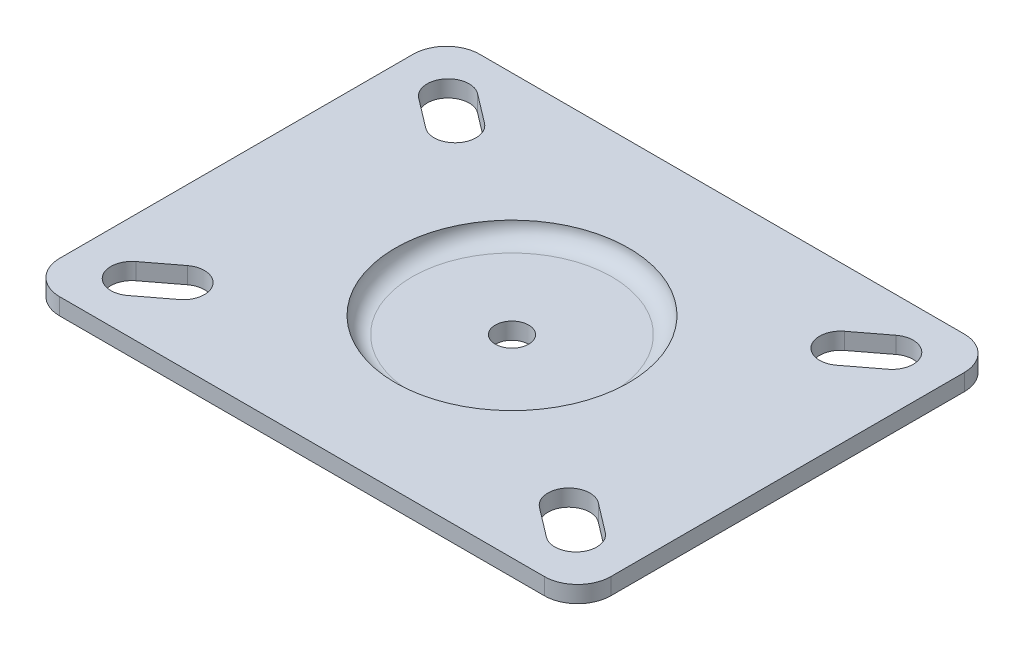
ISO-10303-21;
HEADER;
FILE_DESCRIPTION(('STEP AP214'),'2;1');
FILE_NAME('part.step','',(''),(''),'','','');
FILE_SCHEMA(('AUTOMOTIVE_DESIGN { 1 0 10303 214 1 1 1 1 }'));
ENDSEC;
DATA;
#1=APPLICATION_CONTEXT('core data for automotive mechanical design processes');
#2=APPLICATION_PROTOCOL_DEFINITION('international standard','automotive_design',2000,#1);
#3=PRODUCT_CONTEXT('',#1,'mechanical');
#4=PRODUCT('Part','Part','',(#3));
#5=PRODUCT_RELATED_PRODUCT_CATEGORY('part','',(#4));
#6=PRODUCT_DEFINITION_FORMATION('','',#4);
#7=PRODUCT_DEFINITION_CONTEXT('part definition',#1,'design');
#8=PRODUCT_DEFINITION('design','',#6,#7);
#9=PRODUCT_DEFINITION_SHAPE('','',#8);
#10=(LENGTH_UNIT() NAMED_UNIT(*) SI_UNIT(.MILLI.,.METRE.));
#11=(NAMED_UNIT(*) PLANE_ANGLE_UNIT() SI_UNIT($,.RADIAN.));
#12=(NAMED_UNIT(*) SI_UNIT($,.STERADIAN.) SOLID_ANGLE_UNIT());
#13=UNCERTAINTY_MEASURE_WITH_UNIT(LENGTH_MEASURE(1.E-05),#10,'distance_accuracy_value','');
#14=(GEOMETRIC_REPRESENTATION_CONTEXT(3) GLOBAL_UNCERTAINTY_ASSIGNED_CONTEXT((#13)) GLOBAL_UNIT_ASSIGNED_CONTEXT((#10,
#11,#12)) REPRESENTATION_CONTEXT('',''));
#15=CARTESIAN_POINT('',(0.,0.,0.));
#16=DIRECTION('',(0.,0.,1.));
#17=DIRECTION('',(1.,0.,0.));
#18=AXIS2_PLACEMENT_3D('',#15,#16,#17);
#19=CARTESIAN_POINT('',(52.5,3.175,40.));
#20=DIRECTION('',(-1.,0.,0.));
#21=DIRECTION('',(0.,0.,1.));
#22=AXIS2_PLACEMENT_3D('',#19,#20,#21);
#23=PLANE('',#22);
#24=DIRECTION('',(0.,0.,-1.));
#25=VECTOR('',#24,1.);
#26=CARTESIAN_POINT('',(52.5,3.175,40.));
#27=LINE('',#26,#25);
#28=CARTESIAN_POINT('',(52.5,3.175,33.65));
#29=VERTEX_POINT('',#28);
#30=CARTESIAN_POINT('',(52.5,3.175,-33.65));
#31=VERTEX_POINT('',#30);
#32=EDGE_CURVE('E422',#29,#31,#27,.T.);
#33=ORIENTED_EDGE('',*,*,#32,.F.);
#34=DIRECTION('',(0.,-1.,0.));
#35=VECTOR('',#34,1.);
#36=CARTESIAN_POINT('',(52.5,3.175,33.65));
#37=LINE('',#36,#35);
#38=CARTESIAN_POINT('',(52.5,0.,33.65));
#39=VERTEX_POINT('',#38);
#40=EDGE_CURVE('E493',#29,#39,#37,.T.);
#41=ORIENTED_EDGE('',*,*,#40,.T.);
#42=DIRECTION('',(0.,0.,-1.));
#43=VECTOR('',#42,1.);
#44=CARTESIAN_POINT('',(52.5,0.,40.));
#45=LINE('',#44,#43);
#46=CARTESIAN_POINT('',(52.5,0.,-33.65));
#47=VERTEX_POINT('',#46);
#48=EDGE_CURVE('E437',#39,#47,#45,.T.);
#49=ORIENTED_EDGE('',*,*,#48,.T.);
#50=DIRECTION('',(0.,-1.,0.));
#51=VECTOR('',#50,1.);
#52=CARTESIAN_POINT('',(52.5,3.175,-33.65));
#53=LINE('',#52,#51);
#54=EDGE_CURVE('E490',#47,#31,#53,.F.);
#55=ORIENTED_EDGE('',*,*,#54,.T.);
#56=EDGE_LOOP('',(#33,#41,#49,#55));
#57=FACE_BOUND('',#56,.T.);
#58=ADVANCED_FACE('F38',(#57),#23,.F.);
#59=CARTESIAN_POINT('',(52.5,3.175,-40.));
#60=DIRECTION('',(0.,0.,1.));
#61=DIRECTION('',(1.,0.,0.));
#62=AXIS2_PLACEMENT_3D('',#59,#60,#61);
#63=PLANE('',#62);
#64=DIRECTION('',(-1.,0.,0.));
#65=VECTOR('',#64,1.);
#66=CARTESIAN_POINT('',(52.5,0.,-40.));
#67=LINE('',#66,#65);
#68=CARTESIAN_POINT('',(46.15,0.,-40.));
#69=VERTEX_POINT('',#68);
#70=CARTESIAN_POINT('',(-46.15,0.,-40.));
#71=VERTEX_POINT('',#70);
#72=EDGE_CURVE('E441',#69,#71,#67,.T.);
#73=ORIENTED_EDGE('',*,*,#72,.T.);
#74=DIRECTION('',(0.,-1.,0.));
#75=VECTOR('',#74,1.);
#76=CARTESIAN_POINT('',(-46.15,3.175,-40.));
#77=LINE('',#76,#75);
#78=CARTESIAN_POINT('',(-46.15,3.175,-40.));
#79=VERTEX_POINT('',#78);
#80=EDGE_CURVE('E57',#71,#79,#77,.F.);
#81=ORIENTED_EDGE('',*,*,#80,.T.);
#82=DIRECTION('',(-1.,0.,0.));
#83=VECTOR('',#82,1.);
#84=CARTESIAN_POINT('',(52.5,3.175,-40.));
#85=LINE('',#84,#83);
#86=CARTESIAN_POINT('',(46.15,3.175,-40.));
#87=VERTEX_POINT('',#86);
#88=EDGE_CURVE('E425',#87,#79,#85,.T.);
#89=ORIENTED_EDGE('',*,*,#88,.F.);
#90=DIRECTION('',(0.,-1.,0.));
#91=VECTOR('',#90,1.);
#92=CARTESIAN_POINT('',(46.15,3.175,-40.));
#93=LINE('',#92,#91);
#94=EDGE_CURVE('E484',#87,#69,#93,.T.);
#95=ORIENTED_EDGE('',*,*,#94,.T.);
#96=EDGE_LOOP('',(#73,#81,#89,#95));
#97=FACE_BOUND('',#96,.T.);
#98=ADVANCED_FACE('F516',(#97),#63,.F.);
#99=CARTESIAN_POINT('',(-52.5,3.175,40.));
#100=DIRECTION('',(1.,0.,0.));
#101=DIRECTION('',(0.,0.,-1.));
#102=AXIS2_PLACEMENT_3D('',#99,#100,#101);
#103=PLANE('',#102);
#104=DIRECTION('',(0.,0.,1.));
#105=VECTOR('',#104,1.);
#106=CARTESIAN_POINT('',(-52.5,0.,40.));
#107=LINE('',#106,#105);
#108=CARTESIAN_POINT('',(-52.5,0.,-33.65));
#109=VERTEX_POINT('',#108);
#110=CARTESIAN_POINT('',(-52.5,0.,33.65));
#111=VERTEX_POINT('',#110);
#112=EDGE_CURVE('E444',#109,#111,#107,.T.);
#113=ORIENTED_EDGE('',*,*,#112,.T.);
#114=DIRECTION('',(0.,-1.,0.));
#115=VECTOR('',#114,1.);
#116=CARTESIAN_POINT('',(-52.5,3.175,33.65));
#117=LINE('',#116,#115);
#118=CARTESIAN_POINT('',(-52.5,3.175,33.65));
#119=VERTEX_POINT('',#118);
#120=EDGE_CURVE('E472',#111,#119,#117,.F.);
#121=ORIENTED_EDGE('',*,*,#120,.T.);
#122=DIRECTION('',(0.,0.,1.));
#123=VECTOR('',#122,1.);
#124=CARTESIAN_POINT('',(-52.5,3.175,40.));
#125=LINE('',#124,#123);
#126=CARTESIAN_POINT('',(-52.5,3.175,-33.65));
#127=VERTEX_POINT('',#126);
#128=EDGE_CURVE('E429',#127,#119,#125,.T.);
#129=ORIENTED_EDGE('',*,*,#128,.F.);
#130=DIRECTION('',(0.,-1.,0.));
#131=VECTOR('',#130,1.);
#132=CARTESIAN_POINT('',(-52.5,3.175,-33.65));
#133=LINE('',#132,#131);
#134=EDGE_CURVE('E469',#127,#109,#133,.T.);
#135=ORIENTED_EDGE('',*,*,#134,.T.);
#136=EDGE_LOOP('',(#113,#121,#129,#135));
#137=FACE_BOUND('',#136,.T.);
#138=ADVANCED_FACE('F522',(#137),#103,.F.);
#139=CARTESIAN_POINT('',(52.5,3.175,40.));
#140=DIRECTION('',(0.,0.,-1.));
#141=DIRECTION('',(-1.,0.,0.));
#142=AXIS2_PLACEMENT_3D('',#139,#140,#141);
#143=PLANE('',#142);
#144=DIRECTION('',(1.,0.,0.));
#145=VECTOR('',#144,1.);
#146=CARTESIAN_POINT('',(52.5,3.175,40.));
#147=LINE('',#146,#145);
#148=CARTESIAN_POINT('',(-46.15,3.175,40.));
#149=VERTEX_POINT('',#148);
#150=CARTESIAN_POINT('',(46.15,3.175,40.));
#151=VERTEX_POINT('',#150);
#152=EDGE_CURVE('E432',#149,#151,#147,.T.);
#153=ORIENTED_EDGE('',*,*,#152,.F.);
#154=DIRECTION('',(0.,-1.,0.));
#155=VECTOR('',#154,1.);
#156=CARTESIAN_POINT('',(-46.15,3.175,40.));
#157=LINE('',#156,#155);
#158=CARTESIAN_POINT('',(-46.15,0.,40.));
#159=VERTEX_POINT('',#158);
#160=EDGE_CURVE('E455',#149,#159,#157,.T.);
#161=ORIENTED_EDGE('',*,*,#160,.T.);
#162=DIRECTION('',(1.,0.,0.));
#163=VECTOR('',#162,1.);
#164=CARTESIAN_POINT('',(52.5,0.,40.));
#165=LINE('',#164,#163);
#166=CARTESIAN_POINT('',(46.15,0.,40.));
#167=VERTEX_POINT('',#166);
#168=EDGE_CURVE('E426',#159,#167,#165,.T.);
#169=ORIENTED_EDGE('',*,*,#168,.T.);
#170=DIRECTION('',(0.,-1.,0.));
#171=VECTOR('',#170,1.);
#172=CARTESIAN_POINT('',(46.15,3.175,40.));
#173=LINE('',#172,#171);
#174=EDGE_CURVE('E436',#167,#151,#173,.F.);
#175=ORIENTED_EDGE('',*,*,#174,.T.);
#176=EDGE_LOOP('',(#153,#161,#169,#175));
#177=FACE_BOUND('',#176,.T.);
#178=ADVANCED_FACE('F559',(#177),#143,.F.);
#179=CARTESIAN_POINT('',(52.5,3.175,-40.));
#180=DIRECTION('',(0.,1.,0.));
#181=DIRECTION('',(0.,0.,1.));
#182=AXIS2_PLACEMENT_3D('',#179,#180,#181);
#183=PLANE('',#182);
#184=CARTESIAN_POINT('',(-42.2840110201137,3.175,-30.12115125342));
#185=DIRECTION('',(0.,1.,0.));
#186=DIRECTION('',(0.,0.,-1.));
#187=AXIS2_PLACEMENT_3D('',#184,#185,#186);
#188=CIRCLE('',#187,4.);
#189=CARTESIAN_POINT('',(-39.8598381590623,3.175,-33.3028781335501));
#190=VERTEX_POINT('',#189);
#191=CARTESIAN_POINT('',(-44.7081838811652,3.175,-26.9394243732901));
#192=VERTEX_POINT('',#191);
#193=EDGE_CURVE('E243',#190,#192,#188,.T.);
#194=ORIENTED_EDGE('',*,*,#193,.F.);
#195=DIRECTION('',(-0.795431720032498,0.,-0.606043215262857));
#196=VECTOR('',#195,1.);
#197=CARTESIAN_POINT('',(-39.8598381590623,3.175,-33.3028781335501));
#198=LINE('',#197,#196);
#199=CARTESIAN_POINT('',(-34.2918161188348,3.175,-29.06057562671));
#200=VERTEX_POINT('',#199);
#201=EDGE_CURVE('E249',#200,#190,#198,.T.);
#202=ORIENTED_EDGE('',*,*,#201,.F.);
#203=CARTESIAN_POINT('',(-36.7159889798862,3.175,-25.87884874658));
#204=DIRECTION('',(0.,1.,0.));
#205=DIRECTION('',(0.,0.,-1.));
#206=AXIS2_PLACEMENT_3D('',#203,#204,#205);
#207=CIRCLE('',#206,4.);
#208=CARTESIAN_POINT('',(-39.1401618409377,3.175,-22.6971218664501));
#209=VERTEX_POINT('',#208);
#210=EDGE_CURVE('E277',#209,#200,#207,.T.);
#211=ORIENTED_EDGE('',*,*,#210,.F.);
#212=DIRECTION('',(0.795431720032498,0.,0.606043215262857));
#213=VECTOR('',#212,1.);
#214=CARTESIAN_POINT('',(-44.7081838811652,3.175,-26.9394243732901));
#215=LINE('',#214,#213);
#216=EDGE_CURVE('E270',#192,#209,#215,.T.);
#217=ORIENTED_EDGE('',*,*,#216,.F.);
#218=EDGE_LOOP('',(#194,#202,#211,#217));
#219=FACE_BOUND('',#218,.T.);
#220=CARTESIAN_POINT('',(42.2840110201137,3.175,30.1211512534201));
#221=DIRECTION('',(0.,1.,0.));
#222=DIRECTION('',(0.,0.,-1.));
#223=AXIS2_PLACEMENT_3D('',#220,#221,#222);
#224=CIRCLE('',#223,4.);
#225=CARTESIAN_POINT('',(39.8598381590623,3.175,33.3028781335501));
#226=VERTEX_POINT('',#225);
#227=CARTESIAN_POINT('',(44.7081838811652,3.175,26.9394243732901));
#228=VERTEX_POINT('',#227);
#229=EDGE_CURVE('E301',#226,#228,#224,.T.);
#230=ORIENTED_EDGE('',*,*,#229,.F.);
#231=DIRECTION('',(0.795431720032498,0.,0.606043215262857));
#232=VECTOR('',#231,1.);
#233=CARTESIAN_POINT('',(39.8598381590623,3.175,33.3028781335501));
#234=LINE('',#233,#232);
#235=CARTESIAN_POINT('',(34.2918161188348,3.175,29.06057562671));
#236=VERTEX_POINT('',#235);
#237=EDGE_CURVE('E312',#236,#226,#234,.T.);
#238=ORIENTED_EDGE('',*,*,#237,.F.);
#239=CARTESIAN_POINT('',(36.7159889798863,3.175,25.8788487465801));
#240=DIRECTION('',(0.,1.,0.));
#241=DIRECTION('',(0.,0.,-1.));
#242=AXIS2_PLACEMENT_3D('',#239,#240,#241);
#243=CIRCLE('',#242,4.00000000000001);
#244=CARTESIAN_POINT('',(39.1401618409377,3.175,22.69712186645));
#245=VERTEX_POINT('',#244);
#246=EDGE_CURVE('E308',#245,#236,#243,.T.);
#247=ORIENTED_EDGE('',*,*,#246,.F.);
#248=DIRECTION('',(-0.795431720032498,0.,-0.606043215262857));
#249=VECTOR('',#248,1.);
#250=CARTESIAN_POINT('',(44.7081838811652,3.175,26.9394243732901));
#251=LINE('',#250,#249);
#252=EDGE_CURVE('E304',#228,#245,#251,.T.);
#253=ORIENTED_EDGE('',*,*,#252,.F.);
#254=EDGE_LOOP('',(#230,#238,#247,#253));
#255=FACE_BOUND('',#254,.T.);
#256=CARTESIAN_POINT('',(-42.2840110201137,3.175,30.12115125342));
#257=DIRECTION('',(0.,1.,0.));
#258=DIRECTION('',(0.,0.,1.));
#259=AXIS2_PLACEMENT_3D('',#256,#257,#258);
#260=CIRCLE('',#259,4.);
#261=CARTESIAN_POINT('',(-44.7081838811652,3.175,26.9394243732901));
#262=VERTEX_POINT('',#261);
#263=CARTESIAN_POINT('',(-39.8598381590623,3.175,33.30287813355));
#264=VERTEX_POINT('',#263);
#265=EDGE_CURVE('E342',#262,#264,#260,.T.);
#266=ORIENTED_EDGE('',*,*,#265,.F.);
#267=DIRECTION('',(-0.795431720032498,0.,0.606043215262857));
#268=VECTOR('',#267,1.);
#269=CARTESIAN_POINT('',(-44.7081838811652,3.175,26.9394243732901));
#270=LINE('',#269,#268);
#271=CARTESIAN_POINT('',(-39.1401618409377,3.175,22.6971218664501));
#272=VERTEX_POINT('',#271);
#273=EDGE_CURVE('E351',#272,#262,#270,.T.);
#274=ORIENTED_EDGE('',*,*,#273,.F.);
#275=CARTESIAN_POINT('',(-36.7159889798862,3.175,25.87884874658));
#276=DIRECTION('',(0.,1.,0.));
#277=DIRECTION('',(0.,0.,1.));
#278=AXIS2_PLACEMENT_3D('',#275,#276,#277);
#279=CIRCLE('',#278,4.);
#280=CARTESIAN_POINT('',(-34.2918161188348,3.175,29.06057562671));
#281=VERTEX_POINT('',#280);
#282=EDGE_CURVE('E347',#281,#272,#279,.T.);
#283=ORIENTED_EDGE('',*,*,#282,.F.);
#284=DIRECTION('',(0.795431720032498,0.,-0.606043215262857));
#285=VECTOR('',#284,1.);
#286=CARTESIAN_POINT('',(-39.8598381590623,3.175,33.3028781335501));
#287=LINE('',#286,#285);
#288=EDGE_CURVE('E344',#264,#281,#287,.T.);
#289=ORIENTED_EDGE('',*,*,#288,.F.);
#290=EDGE_LOOP('',(#266,#274,#283,#289));
#291=FACE_BOUND('',#290,.T.);
#292=CARTESIAN_POINT('',(42.2840110201137,3.175,-30.1211512534201));
#293=DIRECTION('',(0.,1.,0.));
#294=DIRECTION('',(0.,0.,1.));
#295=AXIS2_PLACEMENT_3D('',#292,#293,#294);
#296=CIRCLE('',#295,4.);
#297=CARTESIAN_POINT('',(44.7081838811652,3.175,-26.9394243732901));
#298=VERTEX_POINT('',#297);
#299=CARTESIAN_POINT('',(39.8598381590623,3.175,-33.3028781335501));
#300=VERTEX_POINT('',#299);
#301=EDGE_CURVE('E385',#298,#300,#296,.T.);
#302=ORIENTED_EDGE('',*,*,#301,.F.);
#303=DIRECTION('',(0.795431720032498,0.,-0.606043215262857));
#304=VECTOR('',#303,1.);
#305=CARTESIAN_POINT('',(44.7081838811652,3.175,-26.9394243732901));
#306=LINE('',#305,#304);
#307=CARTESIAN_POINT('',(39.1401618409377,3.175,-22.69712186645));
#308=VERTEX_POINT('',#307);
#309=EDGE_CURVE('E396',#308,#298,#306,.T.);
#310=ORIENTED_EDGE('',*,*,#309,.F.);
#311=CARTESIAN_POINT('',(36.7159889798863,3.175,-25.8788487465801));
#312=DIRECTION('',(0.,1.,0.));
#313=DIRECTION('',(0.,0.,1.));
#314=AXIS2_PLACEMENT_3D('',#311,#312,#313);
#315=CIRCLE('',#314,4.00000000000001);
#316=CARTESIAN_POINT('',(34.2918161188348,3.175,-29.06057562671));
#317=VERTEX_POINT('',#316);
#318=EDGE_CURVE('E392',#317,#308,#315,.T.);
#319=ORIENTED_EDGE('',*,*,#318,.F.);
#320=DIRECTION('',(-0.795431720032498,0.,0.606043215262857));
#321=VECTOR('',#320,1.);
#322=CARTESIAN_POINT('',(39.8598381590623,3.175,-33.3028781335501));
#323=LINE('',#322,#321);
#324=EDGE_CURVE('E388',#300,#317,#323,.T.);
#325=ORIENTED_EDGE('',*,*,#324,.F.);
#326=EDGE_LOOP('',(#302,#310,#319,#325));
#327=FACE_BOUND('',#326,.T.);
#328=CARTESIAN_POINT('',(0.,3.175,0.));
#329=DIRECTION('',(0.,1.,0.));
#330=DIRECTION('',(0.,0.,1.));
#331=AXIS2_PLACEMENT_3D('',#328,#329,#330);
#332=CIRCLE('',#331,22.225);
#333=CARTESIAN_POINT('',(0.,3.175,22.225));
#334=VERTEX_POINT('',#333);
#335=EDGE_CURVE('E417',#334,#334,#332,.T.);
#336=ORIENTED_EDGE('',*,*,#335,.F.);
#337=EDGE_LOOP('',(#336));
#338=FACE_BOUND('',#337,.T.);
#339=ORIENTED_EDGE('',*,*,#128,.T.);
#340=CARTESIAN_POINT('',(-46.15,3.175,33.65));
#341=DIRECTION('',(0.,1.,0.));
#342=DIRECTION('',(0.,0.,1.));
#343=AXIS2_PLACEMENT_3D('',#340,#341,#342);
#344=CIRCLE('',#343,6.35);
#345=EDGE_CURVE('E482',#119,#149,#344,.T.);
#346=ORIENTED_EDGE('',*,*,#345,.T.);
#347=ORIENTED_EDGE('',*,*,#152,.T.);
#348=CARTESIAN_POINT('',(46.15,3.175,33.65));
#349=DIRECTION('',(0.,1.,0.));
#350=DIRECTION('',(0.,0.,1.));
#351=AXIS2_PLACEMENT_3D('',#348,#349,#350);
#352=CIRCLE('',#351,6.35);
#353=EDGE_CURVE('E476',#151,#29,#352,.T.);
#354=ORIENTED_EDGE('',*,*,#353,.T.);
#355=ORIENTED_EDGE('',*,*,#32,.T.);
#356=CARTESIAN_POINT('',(46.15,3.175,-33.65));
#357=DIRECTION('',(0.,1.,0.));
#358=DIRECTION('',(0.,0.,1.));
#359=AXIS2_PLACEMENT_3D('',#356,#357,#358);
#360=CIRCLE('',#359,6.35);
#361=EDGE_CURVE('E67',#31,#87,#360,.T.);
#362=ORIENTED_EDGE('',*,*,#361,.T.);
#363=ORIENTED_EDGE('',*,*,#88,.T.);
#364=CARTESIAN_POINT('',(-46.15,3.175,-33.65));
#365=DIRECTION('',(0.,1.,0.));
#366=DIRECTION('',(0.,0.,1.));
#367=AXIS2_PLACEMENT_3D('',#364,#365,#366);
#368=CIRCLE('',#367,6.35);
#369=EDGE_CURVE('E479',#79,#127,#368,.T.);
#370=ORIENTED_EDGE('',*,*,#369,.T.);
#371=EDGE_LOOP('',(#339,#346,#347,#354,#355,#362,#363,#370));
#372=FACE_BOUND('',#371,.T.);
#373=ADVANCED_FACE('F542',(#219,#255,#291,#327,#338,#372),#183,.T.);
#374=CARTESIAN_POINT('',(52.5,0.,-40.));
#375=DIRECTION('',(0.,1.,0.));
#376=DIRECTION('',(0.,0.,1.));
#377=AXIS2_PLACEMENT_3D('',#374,#375,#376);
#378=PLANE('',#377);
#379=DIRECTION('',(0.795431720032499,0.,0.606043215262857));
#380=VECTOR('',#379,1.);
#381=CARTESIAN_POINT('',(-39.8598381590623,0.,-33.3028781335501));
#382=LINE('',#381,#380);
#383=CARTESIAN_POINT('',(-39.8598381590623,0.,-33.3028781335501));
#384=VERTEX_POINT('',#383);
#385=CARTESIAN_POINT('',(-34.2918161188348,0.,-29.06057562671));
#386=VERTEX_POINT('',#385);
#387=EDGE_CURVE('E264',#384,#386,#382,.T.);
#388=ORIENTED_EDGE('',*,*,#387,.F.);
#389=CARTESIAN_POINT('',(-42.2840110201137,0.,-30.12115125342));
#390=DIRECTION('',(0.,1.,0.));
#391=DIRECTION('',(0.,0.,1.));
#392=AXIS2_PLACEMENT_3D('',#389,#390,#391);
#393=CIRCLE('',#392,4.);
#394=CARTESIAN_POINT('',(-44.7081838811652,0.,-26.9394243732901));
#395=VERTEX_POINT('',#394);
#396=EDGE_CURVE('E240',#395,#384,#393,.F.);
#397=ORIENTED_EDGE('',*,*,#396,.F.);
#398=DIRECTION('',(-0.795431720032498,0.,-0.606043215262857));
#399=VECTOR('',#398,1.);
#400=CARTESIAN_POINT('',(-44.7081838811652,0.,-26.9394243732901));
#401=LINE('',#400,#399);
#402=CARTESIAN_POINT('',(-39.1401618409377,0.,-22.6971218664501));
#403=VERTEX_POINT('',#402);
#404=EDGE_CURVE('E253',#403,#395,#401,.T.);
#405=ORIENTED_EDGE('',*,*,#404,.F.);
#406=CARTESIAN_POINT('',(-36.7159889798862,0.,-25.87884874658));
#407=DIRECTION('',(0.,1.,0.));
#408=DIRECTION('',(0.,0.,1.));
#409=AXIS2_PLACEMENT_3D('',#406,#407,#408);
#410=CIRCLE('',#409,4.);
#411=EDGE_CURVE('E272',#386,#403,#410,.F.);
#412=ORIENTED_EDGE('',*,*,#411,.F.);
#413=EDGE_LOOP('',(#388,#397,#405,#412));
#414=FACE_BOUND('',#413,.T.);
#415=DIRECTION('',(-0.795431720032499,0.,-0.606043215262857));
#416=VECTOR('',#415,1.);
#417=CARTESIAN_POINT('',(39.8598381590623,0.,33.3028781335501));
#418=LINE('',#417,#416);
#419=CARTESIAN_POINT('',(39.8598381590623,0.,33.3028781335501));
#420=VERTEX_POINT('',#419);
#421=CARTESIAN_POINT('',(34.2918161188348,0.,29.06057562671));
#422=VERTEX_POINT('',#421);
#423=EDGE_CURVE('E293',#420,#422,#418,.T.);
#424=ORIENTED_EDGE('',*,*,#423,.F.);
#425=CARTESIAN_POINT('',(42.2840110201137,0.,30.1211512534201));
#426=DIRECTION('',(0.,1.,0.));
#427=DIRECTION('',(0.,0.,1.));
#428=AXIS2_PLACEMENT_3D('',#425,#426,#427);
#429=CIRCLE('',#428,4.);
#430=CARTESIAN_POINT('',(44.7081838811652,0.,26.9394243732901));
#431=VERTEX_POINT('',#430);
#432=EDGE_CURVE('E297',#431,#420,#429,.F.);
#433=ORIENTED_EDGE('',*,*,#432,.F.);
#434=DIRECTION('',(0.795431720032498,0.,0.606043215262857));
#435=VECTOR('',#434,1.);
#436=CARTESIAN_POINT('',(44.7081838811652,0.,26.9394243732901));
#437=LINE('',#436,#435);
#438=CARTESIAN_POINT('',(39.1401618409377,0.,22.69712186645));
#439=VERTEX_POINT('',#438);
#440=EDGE_CURVE('E320',#439,#431,#437,.T.);
#441=ORIENTED_EDGE('',*,*,#440,.F.);
#442=CARTESIAN_POINT('',(36.7159889798863,0.,25.8788487465801));
#443=DIRECTION('',(0.,1.,0.));
#444=DIRECTION('',(0.,0.,1.));
#445=AXIS2_PLACEMENT_3D('',#442,#443,#444);
#446=CIRCLE('',#445,4.00000000000001);
#447=EDGE_CURVE('E258',#422,#439,#446,.F.);
#448=ORIENTED_EDGE('',*,*,#447,.F.);
#449=EDGE_LOOP('',(#424,#433,#441,#448));
#450=FACE_BOUND('',#449,.T.);
#451=DIRECTION('',(0.795431720032498,0.,-0.606043215262857));
#452=VECTOR('',#451,1.);
#453=CARTESIAN_POINT('',(-44.7081838811652,0.,26.9394243732901));
#454=LINE('',#453,#452);
#455=CARTESIAN_POINT('',(-44.7081838811652,0.,26.9394243732901));
#456=VERTEX_POINT('',#455);
#457=CARTESIAN_POINT('',(-39.1401618409377,0.,22.6971218664501));
#458=VERTEX_POINT('',#457);
#459=EDGE_CURVE('E336',#456,#458,#454,.T.);
#460=ORIENTED_EDGE('',*,*,#459,.F.);
#461=CARTESIAN_POINT('',(-42.2840110201137,0.,30.12115125342));
#462=DIRECTION('',(0.,1.,0.));
#463=DIRECTION('',(0.,0.,1.));
#464=AXIS2_PLACEMENT_3D('',#461,#462,#463);
#465=CIRCLE('',#464,4.);
#466=CARTESIAN_POINT('',(-39.8598381590623,0.,33.3028781335501));
#467=VERTEX_POINT('',#466);
#468=EDGE_CURVE('E339',#467,#456,#465,.F.);
#469=ORIENTED_EDGE('',*,*,#468,.F.);
#470=DIRECTION('',(-0.795431720032499,0.,0.606043215262857));
#471=VECTOR('',#470,1.);
#472=CARTESIAN_POINT('',(-39.8598381590623,0.,33.3028781335501));
#473=LINE('',#472,#471);
#474=CARTESIAN_POINT('',(-34.2918161188348,0.,29.0605756267101));
#475=VERTEX_POINT('',#474);
#476=EDGE_CURVE('E357',#475,#467,#473,.T.);
#477=ORIENTED_EDGE('',*,*,#476,.F.);
#478=CARTESIAN_POINT('',(-36.7159889798862,0.,25.87884874658));
#479=DIRECTION('',(0.,1.,0.));
#480=DIRECTION('',(0.,0.,1.));
#481=AXIS2_PLACEMENT_3D('',#478,#479,#480);
#482=CIRCLE('',#481,4.);
#483=EDGE_CURVE('E333',#458,#475,#482,.F.);
#484=ORIENTED_EDGE('',*,*,#483,.F.);
#485=EDGE_LOOP('',(#460,#469,#477,#484));
#486=FACE_BOUND('',#485,.T.);
#487=DIRECTION('',(-0.795431720032498,0.,0.606043215262857));
#488=VECTOR('',#487,1.);
#489=CARTESIAN_POINT('',(44.7081838811652,0.,-26.9394243732901));
#490=LINE('',#489,#488);
#491=CARTESIAN_POINT('',(44.7081838811652,0.,-26.9394243732901));
#492=VERTEX_POINT('',#491);
#493=CARTESIAN_POINT('',(39.1401618409377,0.,-22.69712186645));
#494=VERTEX_POINT('',#493);
#495=EDGE_CURVE('E377',#492,#494,#490,.T.);
#496=ORIENTED_EDGE('',*,*,#495,.F.);
#497=CARTESIAN_POINT('',(42.2840110201137,0.,-30.1211512534201));
#498=DIRECTION('',(0.,1.,0.));
#499=DIRECTION('',(0.,0.,1.));
#500=AXIS2_PLACEMENT_3D('',#497,#498,#499);
#501=CIRCLE('',#500,4.);
#502=CARTESIAN_POINT('',(39.8598381590623,0.,-33.3028781335501));
#503=VERTEX_POINT('',#502);
#504=EDGE_CURVE('E381',#503,#492,#501,.F.);
#505=ORIENTED_EDGE('',*,*,#504,.F.);
#506=DIRECTION('',(0.795431720032499,0.,-0.606043215262857));
#507=VECTOR('',#506,1.);
#508=CARTESIAN_POINT('',(39.8598381590623,0.,-33.3028781335501));
#509=LINE('',#508,#507);
#510=CARTESIAN_POINT('',(34.2918161188348,0.,-29.0605756267101));
#511=VERTEX_POINT('',#510);
#512=EDGE_CURVE('E404',#511,#503,#509,.T.);
#513=ORIENTED_EDGE('',*,*,#512,.F.);
#514=CARTESIAN_POINT('',(36.7159889798863,0.,-25.8788487465801));
#515=DIRECTION('',(0.,1.,0.));
#516=DIRECTION('',(0.,0.,1.));
#517=AXIS2_PLACEMENT_3D('',#514,#515,#516);
#518=CIRCLE('',#517,4.00000000000001);
#519=EDGE_CURVE('E374',#494,#511,#518,.F.);
#520=ORIENTED_EDGE('',*,*,#519,.F.);
#521=EDGE_LOOP('',(#496,#505,#513,#520));
#522=FACE_BOUND('',#521,.T.);
#523=CARTESIAN_POINT('',(0.,0.,0.));
#524=DIRECTION('',(0.,1.,0.));
#525=DIRECTION('',(0.,0.,1.));
#526=AXIS2_PLACEMENT_3D('',#523,#524,#525);
#527=CIRCLE('',#526,25.4);
#528=CARTESIAN_POINT('',(0.,0.,25.4));
#529=VERTEX_POINT('',#528);
#530=EDGE_CURVE('E421',#529,#529,#527,.T.);
#531=ORIENTED_EDGE('',*,*,#530,.T.);
#532=EDGE_LOOP('',(#531));
#533=FACE_BOUND('',#532,.T.);
#534=ORIENTED_EDGE('',*,*,#168,.F.);
#535=CARTESIAN_POINT('',(-46.15,0.,33.65));
#536=DIRECTION('',(0.,1.,0.));
#537=DIRECTION('',(0.,0.,1.));
#538=AXIS2_PLACEMENT_3D('',#535,#536,#537);
#539=CIRCLE('',#538,6.35);
#540=EDGE_CURVE('E467',#159,#111,#539,.F.);
#541=ORIENTED_EDGE('',*,*,#540,.T.);
#542=ORIENTED_EDGE('',*,*,#112,.F.);
#543=CARTESIAN_POINT('',(-46.15,0.,-33.65));
#544=DIRECTION('',(0.,1.,0.));
#545=DIRECTION('',(0.,0.,1.));
#546=AXIS2_PLACEMENT_3D('',#543,#544,#545);
#547=CIRCLE('',#546,6.35);
#548=EDGE_CURVE('E464',#109,#71,#547,.F.);
#549=ORIENTED_EDGE('',*,*,#548,.T.);
#550=ORIENTED_EDGE('',*,*,#72,.F.);
#551=CARTESIAN_POINT('',(46.15,0.,-33.65));
#552=DIRECTION('',(0.,1.,0.));
#553=DIRECTION('',(0.,0.,1.));
#554=AXIS2_PLACEMENT_3D('',#551,#552,#553);
#555=CIRCLE('',#554,6.35);
#556=EDGE_CURVE('E458',#69,#47,#555,.F.);
#557=ORIENTED_EDGE('',*,*,#556,.T.);
#558=ORIENTED_EDGE('',*,*,#48,.F.);
#559=CARTESIAN_POINT('',(46.15,0.,33.65));
#560=DIRECTION('',(0.,1.,0.));
#561=DIRECTION('',(0.,0.,1.));
#562=AXIS2_PLACEMENT_3D('',#559,#560,#561);
#563=CIRCLE('',#562,6.35);
#564=EDGE_CURVE('E461',#39,#167,#563,.F.);
#565=ORIENTED_EDGE('',*,*,#564,.T.);
#566=EDGE_LOOP('',(#534,#541,#542,#549,#550,#557,#558,#565));
#567=FACE_BOUND('',#566,.T.);
#568=ADVANCED_FACE('F261',(#414,#450,#486,#522,#533,#567),#378,.F.);
#569=CARTESIAN_POINT('',(0.,-3.175,0.));
#570=DIRECTION('',(0.,1.,0.));
#571=DIRECTION('',(0.,0.,1.));
#572=AXIS2_PLACEMENT_3D('',#569,#570,#571);
#573=PLANE('',#572);
#574=CARTESIAN_POINT('',(0.,-3.175,0.));
#575=DIRECTION('',(0.,1.,0.));
#576=DIRECTION('',(0.,0.,1.));
#577=AXIS2_PLACEMENT_3D('',#574,#575,#576);
#578=CIRCLE('',#577,22.225);
#579=CARTESIAN_POINT('',(0.,-3.175,22.225));
#580=VERTEX_POINT('',#579);
#581=EDGE_CURVE('E11',#580,#580,#578,.F.);
#582=ORIENTED_EDGE('',*,*,#581,.T.);
#583=EDGE_LOOP('',(#582));
#584=FACE_BOUND('',#583,.T.);
#585=CARTESIAN_POINT('',(0.,-3.175,0.));
#586=DIRECTION('',(0.,1.,0.));
#587=DIRECTION('',(0.,0.,1.));
#588=AXIS2_PLACEMENT_3D('',#585,#586,#587);
#589=CIRCLE('',#588,3.175);
#590=CARTESIAN_POINT('',(0.,-3.175,3.175));
#591=VERTEX_POINT('',#590);
#592=EDGE_CURVE('E370',#591,#591,#589,.F.);
#593=ORIENTED_EDGE('',*,*,#592,.F.);
#594=EDGE_LOOP('',(#593));
#595=FACE_BOUND('',#594,.T.);
#596=ADVANCED_FACE('F570',(#584,#595),#573,.F.);
#597=CARTESIAN_POINT('',(0.,0.,0.));
#598=DIRECTION('',(0.,1.,0.));
#599=DIRECTION('',(0.,0.,1.));
#600=AXIS2_PLACEMENT_3D('',#597,#598,#599);
#601=PLANE('',#600);
#602=CARTESIAN_POINT('',(0.,0.,0.));
#603=DIRECTION('',(0.,1.,0.));
#604=DIRECTION('',(0.,0.,1.));
#605=AXIS2_PLACEMENT_3D('',#602,#603,#604);
#606=CIRCLE('',#605,19.05);
#607=CARTESIAN_POINT('',(0.,0.,19.05));
#608=VERTEX_POINT('',#607);
#609=EDGE_CURVE('E47',#608,#608,#606,.T.);
#610=ORIENTED_EDGE('',*,*,#609,.T.);
#611=EDGE_LOOP('',(#610));
#612=FACE_BOUND('',#611,.T.);
#613=CARTESIAN_POINT('',(0.,0.,0.));
#614=DIRECTION('',(0.,1.,0.));
#615=DIRECTION('',(0.,0.,1.));
#616=AXIS2_PLACEMENT_3D('',#613,#614,#615);
#617=CIRCLE('',#616,3.175);
#618=CARTESIAN_POINT('',(0.,0.,3.175));
#619=VERTEX_POINT('',#618);
#620=EDGE_CURVE('E366',#619,#619,#617,.F.);
#621=ORIENTED_EDGE('',*,*,#620,.T.);
#622=EDGE_LOOP('',(#621));
#623=FACE_BOUND('',#622,.T.);
#624=ADVANCED_FACE('F500',(#612,#623),#601,.T.);
#625=CARTESIAN_POINT('',(42.2840110201137,-3.176,-30.1211512534201));
#626=DIRECTION('',(0.,1.,0.));
#627=DIRECTION('',(0.,0.,1.));
#628=AXIS2_PLACEMENT_3D('',#625,#626,#627);
#629=CYLINDRICAL_SURFACE('',#628,4.);
#630=ORIENTED_EDGE('',*,*,#504,.T.);
#631=DIRECTION('',(0.,1.,0.));
#632=VECTOR('',#631,1.);
#633=CARTESIAN_POINT('',(44.7081838811652,-3.176,-26.9394243732901));
#634=LINE('',#633,#632);
#635=EDGE_CURVE('E401',#492,#298,#634,.T.);
#636=ORIENTED_EDGE('',*,*,#635,.T.);
#637=ORIENTED_EDGE('',*,*,#301,.T.);
#638=DIRECTION('',(0.,1.,0.));
#639=VECTOR('',#638,1.);
#640=CARTESIAN_POINT('',(39.8598381590623,-3.176,-33.3028781335501));
#641=LINE('',#640,#639);
#642=EDGE_CURVE('E400',#503,#300,#641,.T.);
#643=ORIENTED_EDGE('',*,*,#642,.F.);
#644=EDGE_LOOP('',(#630,#636,#637,#643));
#645=FACE_BOUND('',#644,.T.);
#646=ADVANCED_FACE('F577',(#645),#629,.F.);
#647=CARTESIAN_POINT('',(44.7081838811652,-3.176,-26.9394243732901));
#648=DIRECTION('',(0.606043215262857,0.,0.795431720032498));
#649=DIRECTION('',(0.795431720032498,0.,-0.606043215262857));
#650=AXIS2_PLACEMENT_3D('',#647,#648,#649);
#651=PLANE('',#650);
#652=ORIENTED_EDGE('',*,*,#495,.T.);
#653=DIRECTION('',(0.,1.,0.));
#654=VECTOR('',#653,1.);
#655=CARTESIAN_POINT('',(39.1401618409377,-3.176,-22.69712186645));
#656=LINE('',#655,#654);
#657=EDGE_CURVE('E405',#494,#308,#656,.T.);
#658=ORIENTED_EDGE('',*,*,#657,.T.);
#659=ORIENTED_EDGE('',*,*,#309,.T.);
#660=ORIENTED_EDGE('',*,*,#635,.F.);
#661=EDGE_LOOP('',(#652,#658,#659,#660));
#662=FACE_BOUND('',#661,.T.);
#663=ADVANCED_FACE('F580',(#662),#651,.F.);
#664=CARTESIAN_POINT('',(36.7159889798863,-3.176,-25.8788487465801));
#665=DIRECTION('',(0.,1.,0.));
#666=DIRECTION('',(0.,0.,1.));
#667=AXIS2_PLACEMENT_3D('',#664,#665,#666);
#668=CYLINDRICAL_SURFACE('',#667,4.00000000000001);
#669=ORIENTED_EDGE('',*,*,#519,.T.);
#670=DIRECTION('',(0.,1.,0.));
#671=VECTOR('',#670,1.);
#672=CARTESIAN_POINT('',(34.2918161188348,-3.176,-29.06057562671));
#673=LINE('',#672,#671);
#674=EDGE_CURVE('E408',#511,#317,#673,.T.);
#675=ORIENTED_EDGE('',*,*,#674,.T.);
#676=ORIENTED_EDGE('',*,*,#318,.T.);
#677=ORIENTED_EDGE('',*,*,#657,.F.);
#678=EDGE_LOOP('',(#669,#675,#676,#677));
#679=FACE_BOUND('',#678,.T.);
#680=ADVANCED_FACE('F586',(#679),#668,.F.);
#681=CARTESIAN_POINT('',(39.8598381590623,-3.176,-33.3028781335501));
#682=DIRECTION('',(-0.606043215262857,0.,-0.795431720032498));
#683=DIRECTION('',(-0.795431720032499,0.,0.606043215262857));
#684=AXIS2_PLACEMENT_3D('',#681,#682,#683);
#685=PLANE('',#684);
#686=ORIENTED_EDGE('',*,*,#512,.T.);
#687=ORIENTED_EDGE('',*,*,#642,.T.);
#688=ORIENTED_EDGE('',*,*,#324,.T.);
#689=ORIENTED_EDGE('',*,*,#674,.F.);
#690=EDGE_LOOP('',(#686,#687,#688,#689));
#691=FACE_BOUND('',#690,.T.);
#692=ADVANCED_FACE('F582',(#691),#685,.F.);
#693=CARTESIAN_POINT('',(0.,-3.176,0.));
#694=DIRECTION('',(0.,1.,0.));
#695=DIRECTION('',(0.,0.,1.));
#696=AXIS2_PLACEMENT_3D('',#693,#694,#695);
#697=CYLINDRICAL_SURFACE('',#696,3.175);
#698=ORIENTED_EDGE('',*,*,#620,.F.);
#699=EDGE_LOOP('',(#698));
#700=FACE_BOUND('',#699,.T.);
#701=ORIENTED_EDGE('',*,*,#592,.T.);
#702=EDGE_LOOP('',(#701));
#703=FACE_BOUND('',#702,.T.);
#704=ADVANCED_FACE('F585',(#700,#703),#697,.F.);
#705=CARTESIAN_POINT('',(-42.2840110201137,-3.176,30.12115125342));
#706=DIRECTION('',(0.,1.,0.));
#707=DIRECTION('',(0.,0.,1.));
#708=AXIS2_PLACEMENT_3D('',#705,#706,#707);
#709=CYLINDRICAL_SURFACE('',#708,4.);
#710=ORIENTED_EDGE('',*,*,#468,.T.);
#711=DIRECTION('',(0.,1.,0.));
#712=VECTOR('',#711,1.);
#713=CARTESIAN_POINT('',(-44.7081838811652,-3.176,26.9394243732901));
#714=LINE('',#713,#712);
#715=EDGE_CURVE('E355',#456,#262,#714,.T.);
#716=ORIENTED_EDGE('',*,*,#715,.T.);
#717=ORIENTED_EDGE('',*,*,#265,.T.);
#718=DIRECTION('',(0.,1.,0.));
#719=VECTOR('',#718,1.);
#720=CARTESIAN_POINT('',(-39.8598381590623,-3.176,33.3028781335501));
#721=LINE('',#720,#719);
#722=EDGE_CURVE('E354',#467,#264,#721,.T.);
#723=ORIENTED_EDGE('',*,*,#722,.F.);
#724=EDGE_LOOP('',(#710,#716,#717,#723));
#725=FACE_BOUND('',#724,.T.);
#726=ADVANCED_FACE('F596',(#725),#709,.F.);
#727=CARTESIAN_POINT('',(-44.7081838811652,-3.176,26.9394243732901));
#728=DIRECTION('',(-0.606043215262857,0.,-0.795431720032498));
#729=DIRECTION('',(-0.795431720032498,0.,0.606043215262857));
#730=AXIS2_PLACEMENT_3D('',#727,#728,#729);
#731=PLANE('',#730);
#732=ORIENTED_EDGE('',*,*,#459,.T.);
#733=DIRECTION('',(0.,1.,0.));
#734=VECTOR('',#733,1.);
#735=CARTESIAN_POINT('',(-39.1401618409377,-3.176,22.6971218664501));
#736=LINE('',#735,#734);
#737=EDGE_CURVE('E358',#458,#272,#736,.T.);
#738=ORIENTED_EDGE('',*,*,#737,.T.);
#739=ORIENTED_EDGE('',*,*,#273,.T.);
#740=ORIENTED_EDGE('',*,*,#715,.F.);
#741=EDGE_LOOP('',(#732,#738,#739,#740));
#742=FACE_BOUND('',#741,.T.);
#743=ADVANCED_FACE('F600',(#742),#731,.F.);
#744=CARTESIAN_POINT('',(-36.7159889798862,-3.176,25.87884874658));
#745=DIRECTION('',(0.,1.,0.));
#746=DIRECTION('',(0.,0.,1.));
#747=AXIS2_PLACEMENT_3D('',#744,#745,#746);
#748=CYLINDRICAL_SURFACE('',#747,4.);
#749=ORIENTED_EDGE('',*,*,#483,.T.);
#750=DIRECTION('',(0.,1.,0.));
#751=VECTOR('',#750,1.);
#752=CARTESIAN_POINT('',(-34.2918161188348,-3.176,29.06057562671));
#753=LINE('',#752,#751);
#754=EDGE_CURVE('E360',#475,#281,#753,.T.);
#755=ORIENTED_EDGE('',*,*,#754,.T.);
#756=ORIENTED_EDGE('',*,*,#282,.T.);
#757=ORIENTED_EDGE('',*,*,#737,.F.);
#758=EDGE_LOOP('',(#749,#755,#756,#757));
#759=FACE_BOUND('',#758,.T.);
#760=ADVANCED_FACE('F606',(#759),#748,.F.);
#761=CARTESIAN_POINT('',(-39.8598381590623,-3.176,33.3028781335501));
#762=DIRECTION('',(0.606043215262857,0.,0.795431720032498));
#763=DIRECTION('',(0.795431720032499,0.,-0.606043215262857));
#764=AXIS2_PLACEMENT_3D('',#761,#762,#763);
#765=PLANE('',#764);
#766=ORIENTED_EDGE('',*,*,#476,.T.);
#767=ORIENTED_EDGE('',*,*,#722,.T.);
#768=ORIENTED_EDGE('',*,*,#288,.T.);
#769=ORIENTED_EDGE('',*,*,#754,.F.);
#770=EDGE_LOOP('',(#766,#767,#768,#769));
#771=FACE_BOUND('',#770,.T.);
#772=ADVANCED_FACE('F602',(#771),#765,.F.);
#773=CARTESIAN_POINT('',(42.2840110201137,-3.176,30.1211512534201));
#774=DIRECTION('',(0.,1.,0.));
#775=DIRECTION('',(0.,0.,1.));
#776=AXIS2_PLACEMENT_3D('',#773,#774,#775);
#777=CYLINDRICAL_SURFACE('',#776,4.);
#778=ORIENTED_EDGE('',*,*,#432,.T.);
#779=DIRECTION('',(0.,1.,0.));
#780=VECTOR('',#779,1.);
#781=CARTESIAN_POINT('',(39.8598381590623,-3.176,33.3028781335501));
#782=LINE('',#781,#780);
#783=EDGE_CURVE('E317',#420,#226,#782,.T.);
#784=ORIENTED_EDGE('',*,*,#783,.T.);
#785=ORIENTED_EDGE('',*,*,#229,.T.);
#786=DIRECTION('',(0.,1.,0.));
#787=VECTOR('',#786,1.);
#788=CARTESIAN_POINT('',(44.7081838811652,-3.176,26.9394243732901));
#789=LINE('',#788,#787);
#790=EDGE_CURVE('E316',#431,#228,#789,.T.);
#791=ORIENTED_EDGE('',*,*,#790,.F.);
#792=EDGE_LOOP('',(#778,#784,#785,#791));
#793=FACE_BOUND('',#792,.T.);
#794=ADVANCED_FACE('F605',(#793),#777,.F.);
#795=CARTESIAN_POINT('',(39.8598381590623,-3.176,33.3028781335501));
#796=DIRECTION('',(-0.606043215262857,0.,0.795431720032498));
#797=DIRECTION('',(0.795431720032499,0.,0.606043215262857));
#798=AXIS2_PLACEMENT_3D('',#795,#796,#797);
#799=PLANE('',#798);
#800=ORIENTED_EDGE('',*,*,#423,.T.);
#801=DIRECTION('',(0.,1.,0.));
#802=VECTOR('',#801,1.);
#803=CARTESIAN_POINT('',(34.2918161188348,-3.176,29.06057562671));
#804=LINE('',#803,#802);
#805=EDGE_CURVE('E321',#422,#236,#804,.T.);
#806=ORIENTED_EDGE('',*,*,#805,.T.);
#807=ORIENTED_EDGE('',*,*,#237,.T.);
#808=ORIENTED_EDGE('',*,*,#783,.F.);
#809=EDGE_LOOP('',(#800,#806,#807,#808));
#810=FACE_BOUND('',#809,.T.);
#811=ADVANCED_FACE('F616',(#810),#799,.F.);
#812=CARTESIAN_POINT('',(36.7159889798863,-3.176,25.8788487465801));
#813=DIRECTION('',(0.,1.,0.));
#814=DIRECTION('',(0.,0.,1.));
#815=AXIS2_PLACEMENT_3D('',#812,#813,#814);
#816=CYLINDRICAL_SURFACE('',#815,4.00000000000001);
#817=ORIENTED_EDGE('',*,*,#447,.T.);
#818=DIRECTION('',(0.,1.,0.));
#819=VECTOR('',#818,1.);
#820=CARTESIAN_POINT('',(39.1401618409377,-3.176,22.69712186645));
#821=LINE('',#820,#819);
#822=EDGE_CURVE('E324',#439,#245,#821,.T.);
#823=ORIENTED_EDGE('',*,*,#822,.T.);
#824=ORIENTED_EDGE('',*,*,#246,.T.);
#825=ORIENTED_EDGE('',*,*,#805,.F.);
#826=EDGE_LOOP('',(#817,#823,#824,#825));
#827=FACE_BOUND('',#826,.T.);
#828=ADVANCED_FACE('F621',(#827),#816,.F.);
#829=CARTESIAN_POINT('',(44.7081838811652,-3.176,26.9394243732901));
#830=DIRECTION('',(0.606043215262857,0.,-0.795431720032498));
#831=DIRECTION('',(-0.795431720032498,0.,-0.606043215262857));
#832=AXIS2_PLACEMENT_3D('',#829,#830,#831);
#833=PLANE('',#832);
#834=ORIENTED_EDGE('',*,*,#440,.T.);
#835=ORIENTED_EDGE('',*,*,#790,.T.);
#836=ORIENTED_EDGE('',*,*,#252,.T.);
#837=ORIENTED_EDGE('',*,*,#822,.F.);
#838=EDGE_LOOP('',(#834,#835,#836,#837));
#839=FACE_BOUND('',#838,.T.);
#840=ADVANCED_FACE('F618',(#839),#833,.F.);
#841=CARTESIAN_POINT('',(-42.2840110201137,-3.176,-30.12115125342));
#842=DIRECTION('',(0.,1.,0.));
#843=DIRECTION('',(0.,0.,1.));
#844=AXIS2_PLACEMENT_3D('',#841,#842,#843);
#845=CYLINDRICAL_SURFACE('',#844,4.);
#846=ORIENTED_EDGE('',*,*,#396,.T.);
#847=DIRECTION('',(0.,1.,0.));
#848=VECTOR('',#847,1.);
#849=CARTESIAN_POINT('',(-39.8598381590623,-3.176,-33.3028781335501));
#850=LINE('',#849,#848);
#851=EDGE_CURVE('E259',#384,#190,#850,.T.);
#852=ORIENTED_EDGE('',*,*,#851,.T.);
#853=ORIENTED_EDGE('',*,*,#193,.T.);
#854=DIRECTION('',(0.,1.,0.));
#855=VECTOR('',#854,1.);
#856=CARTESIAN_POINT('',(-44.7081838811652,-3.176,-26.9394243732901));
#857=LINE('',#856,#855);
#858=EDGE_CURVE('E236',#395,#192,#857,.T.);
#859=ORIENTED_EDGE('',*,*,#858,.F.);
#860=EDGE_LOOP('',(#846,#852,#853,#859));
#861=FACE_BOUND('',#860,.T.);
#862=ADVANCED_FACE('F238',(#861),#845,.F.);
#863=CARTESIAN_POINT('',(-39.8598381590623,-3.176,-33.3028781335501));
#864=DIRECTION('',(0.606043215262857,0.,-0.795431720032498));
#865=DIRECTION('',(-0.795431720032499,0.,-0.606043215262857));
#866=AXIS2_PLACEMENT_3D('',#863,#864,#865);
#867=PLANE('',#866);
#868=ORIENTED_EDGE('',*,*,#387,.T.);
#869=DIRECTION('',(0.,1.,0.));
#870=VECTOR('',#869,1.);
#871=CARTESIAN_POINT('',(-34.2918161188348,-3.176,-29.06057562671));
#872=LINE('',#871,#870);
#873=EDGE_CURVE('E286',#386,#200,#872,.T.);
#874=ORIENTED_EDGE('',*,*,#873,.T.);
#875=ORIENTED_EDGE('',*,*,#201,.T.);
#876=ORIENTED_EDGE('',*,*,#851,.F.);
#877=EDGE_LOOP('',(#868,#874,#875,#876));
#878=FACE_BOUND('',#877,.T.);
#879=ADVANCED_FACE('F631',(#878),#867,.F.);
#880=CARTESIAN_POINT('',(-36.7159889798862,-3.176,-25.87884874658));
#881=DIRECTION('',(0.,1.,0.));
#882=DIRECTION('',(0.,0.,1.));
#883=AXIS2_PLACEMENT_3D('',#880,#881,#882);
#884=CYLINDRICAL_SURFACE('',#883,4.);
#885=ORIENTED_EDGE('',*,*,#411,.T.);
#886=DIRECTION('',(0.,1.,0.));
#887=VECTOR('',#886,1.);
#888=CARTESIAN_POINT('',(-39.1401618409377,-3.176,-22.6971218664501));
#889=LINE('',#888,#887);
#890=EDGE_CURVE('E248',#403,#209,#889,.T.);
#891=ORIENTED_EDGE('',*,*,#890,.T.);
#892=ORIENTED_EDGE('',*,*,#210,.T.);
#893=ORIENTED_EDGE('',*,*,#873,.F.);
#894=EDGE_LOOP('',(#885,#891,#892,#893));
#895=FACE_BOUND('',#894,.T.);
#896=ADVANCED_FACE('F634',(#895),#884,.F.);
#897=CARTESIAN_POINT('',(-44.7081838811652,-3.176,-26.9394243732901));
#898=DIRECTION('',(-0.606043215262857,0.,0.795431720032498));
#899=DIRECTION('',(0.795431720032498,0.,0.606043215262857));
#900=AXIS2_PLACEMENT_3D('',#897,#898,#899);
#901=PLANE('',#900);
#902=ORIENTED_EDGE('',*,*,#404,.T.);
#903=ORIENTED_EDGE('',*,*,#858,.T.);
#904=ORIENTED_EDGE('',*,*,#216,.T.);
#905=ORIENTED_EDGE('',*,*,#890,.F.);
#906=EDGE_LOOP('',(#902,#903,#904,#905));
#907=FACE_BOUND('',#906,.T.);
#908=ADVANCED_FACE('F254',(#907),#901,.F.);
#909=CARTESIAN_POINT('',(-46.15,3.175,33.65));
#910=DIRECTION('',(0.,-1.,0.));
#911=DIRECTION('',(0.,0.,-1.));
#912=AXIS2_PLACEMENT_3D('',#909,#910,#911);
#913=CYLINDRICAL_SURFACE('',#912,6.35);
#914=ORIENTED_EDGE('',*,*,#345,.F.);
#915=ORIENTED_EDGE('',*,*,#120,.F.);
#916=ORIENTED_EDGE('',*,*,#540,.F.);
#917=ORIENTED_EDGE('',*,*,#160,.F.);
#918=EDGE_LOOP('',(#914,#915,#916,#917));
#919=FACE_BOUND('',#918,.T.);
#920=ADVANCED_FACE('F527',(#919),#913,.T.);
#921=CARTESIAN_POINT('',(-46.15,3.175,-33.65));
#922=DIRECTION('',(0.,-1.,0.));
#923=DIRECTION('',(0.,0.,-1.));
#924=AXIS2_PLACEMENT_3D('',#921,#922,#923);
#925=CYLINDRICAL_SURFACE('',#924,6.35);
#926=ORIENTED_EDGE('',*,*,#369,.F.);
#927=ORIENTED_EDGE('',*,*,#80,.F.);
#928=ORIENTED_EDGE('',*,*,#548,.F.);
#929=ORIENTED_EDGE('',*,*,#134,.F.);
#930=EDGE_LOOP('',(#926,#927,#928,#929));
#931=FACE_BOUND('',#930,.T.);
#932=ADVANCED_FACE('F530',(#931),#925,.T.);
#933=CARTESIAN_POINT('',(46.15,3.175,33.65));
#934=DIRECTION('',(0.,-1.,0.));
#935=DIRECTION('',(0.,0.,-1.));
#936=AXIS2_PLACEMENT_3D('',#933,#934,#935);
#937=CYLINDRICAL_SURFACE('',#936,6.35);
#938=ORIENTED_EDGE('',*,*,#353,.F.);
#939=ORIENTED_EDGE('',*,*,#174,.F.);
#940=ORIENTED_EDGE('',*,*,#564,.F.);
#941=ORIENTED_EDGE('',*,*,#40,.F.);
#942=EDGE_LOOP('',(#938,#939,#940,#941));
#943=FACE_BOUND('',#942,.T.);
#944=ADVANCED_FACE('F512',(#943),#937,.T.);
#945=CARTESIAN_POINT('',(46.15,3.175,-33.65));
#946=DIRECTION('',(0.,-1.,0.));
#947=DIRECTION('',(0.,0.,-1.));
#948=AXIS2_PLACEMENT_3D('',#945,#946,#947);
#949=CYLINDRICAL_SURFACE('',#948,6.35);
#950=ORIENTED_EDGE('',*,*,#361,.F.);
#951=ORIENTED_EDGE('',*,*,#54,.F.);
#952=ORIENTED_EDGE('',*,*,#556,.F.);
#953=ORIENTED_EDGE('',*,*,#94,.F.);
#954=EDGE_LOOP('',(#950,#951,#952,#953));
#955=FACE_BOUND('',#954,.T.);
#956=ADVANCED_FACE('F505',(#955),#949,.T.);
#957=CARTESIAN_POINT('',(0.,3.175,0.));
#958=DIRECTION('',(0.,1.,0.));
#959=DIRECTION('',(0.,0.,1.));
#960=AXIS2_PLACEMENT_3D('',#957,#958,#959);
#961=TOROIDAL_SURFACE('',#960,19.05,3.175);
#962=ORIENTED_EDGE('',*,*,#335,.T.);
#963=EDGE_LOOP('',(#962));
#964=FACE_BOUND('',#963,.T.);
#965=ORIENTED_EDGE('',*,*,#609,.F.);
#966=EDGE_LOOP('',(#965));
#967=FACE_BOUND('',#966,.T.);
#968=ADVANCED_FACE('F503',(#964,#967),#961,.F.);
#969=CARTESIAN_POINT('',(0.,0.,0.));
#970=DIRECTION('',(0.,1.,0.));
#971=DIRECTION('',(0.,0.,1.));
#972=AXIS2_PLACEMENT_3D('',#969,#970,#971);
#973=TOROIDAL_SURFACE('',#972,22.225,3.175);
#974=ORIENTED_EDGE('',*,*,#581,.F.);
#975=EDGE_LOOP('',(#974));
#976=FACE_BOUND('',#975,.T.);
#977=ORIENTED_EDGE('',*,*,#530,.F.);
#978=EDGE_LOOP('',(#977));
#979=FACE_BOUND('',#978,.T.);
#980=ADVANCED_FACE('F40',(#976,#979),#973,.T.);
#981=CLOSED_SHELL('',(#58,#98,#138,#178,#373,#568,#596,#624,#646,#663,#680,#692,#704,#726,#743,
#760,#772,#794,#811,#828,#840,#862,#879,#896,#908,#920,#932,#944,#956,#968,#980));
#982=MANIFOLD_SOLID_BREP('B2',#981);
#983=ADVANCED_BREP_SHAPE_REPRESENTATION('',(#18,#982),#14);
#984=SHAPE_DEFINITION_REPRESENTATION(#9,#983);
ENDSEC;
END-ISO-10303-21;
